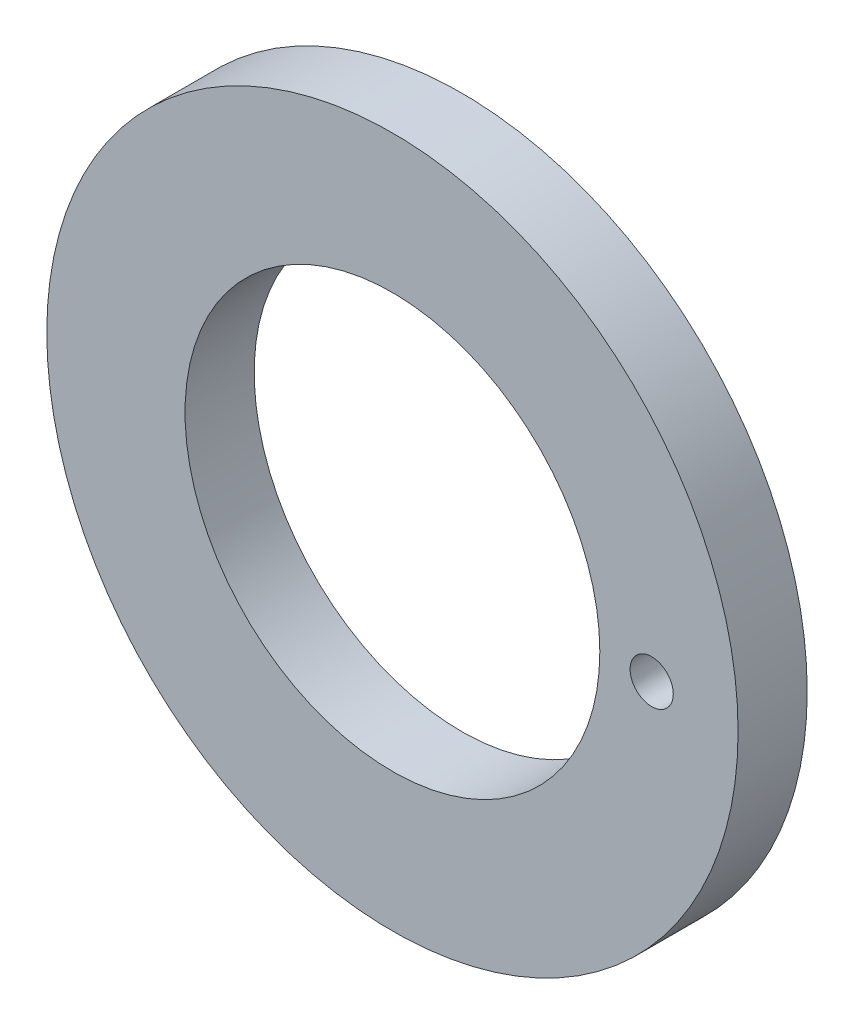
ISO-10303-21;
HEADER;
FILE_DESCRIPTION(('STEP AP214'),'2;1');
FILE_NAME('part.step','',(''),(''),'','','');
FILE_SCHEMA(('AUTOMOTIVE_DESIGN { 1 0 10303 214 1 1 1 1 }'));
ENDSEC;
DATA;
#1=APPLICATION_CONTEXT('core data for automotive mechanical design processes');
#2=APPLICATION_PROTOCOL_DEFINITION('international standard','automotive_design',2000,#1);
#3=PRODUCT_CONTEXT('',#1,'mechanical');
#4=PRODUCT('Part','Part','',(#3));
#5=PRODUCT_RELATED_PRODUCT_CATEGORY('part','',(#4));
#6=PRODUCT_DEFINITION_FORMATION('','',#4);
#7=PRODUCT_DEFINITION_CONTEXT('part definition',#1,'design');
#8=PRODUCT_DEFINITION('design','',#6,#7);
#9=PRODUCT_DEFINITION_SHAPE('','',#8);
#10=(LENGTH_UNIT() NAMED_UNIT(*) SI_UNIT(.MILLI.,.METRE.));
#11=(NAMED_UNIT(*) PLANE_ANGLE_UNIT() SI_UNIT($,.RADIAN.));
#12=(NAMED_UNIT(*) SI_UNIT($,.STERADIAN.) SOLID_ANGLE_UNIT());
#13=UNCERTAINTY_MEASURE_WITH_UNIT(LENGTH_MEASURE(1.E-05),#10,'distance_accuracy_value','');
#14=(GEOMETRIC_REPRESENTATION_CONTEXT(3) GLOBAL_UNCERTAINTY_ASSIGNED_CONTEXT((#13)) GLOBAL_UNIT_ASSIGNED_CONTEXT((#10,
#11,#12)) REPRESENTATION_CONTEXT('',''));
#15=CARTESIAN_POINT('',(0.,0.,0.));
#16=DIRECTION('',(0.,0.,1.));
#17=DIRECTION('',(1.,0.,0.));
#18=AXIS2_PLACEMENT_3D('',#15,#16,#17);
#19=CARTESIAN_POINT('',(0.,0.,5.08));
#20=DIRECTION('',(0.,0.,1.));
#21=DIRECTION('',(1.,0.,0.));
#22=AXIS2_PLACEMENT_3D('',#19,#20,#21);
#23=PLANE('',#22);
#24=CARTESIAN_POINT('',(19.05,0.,5.08));
#25=DIRECTION('',(0.,0.,1.));
#26=DIRECTION('',(1.,0.,0.));
#27=AXIS2_PLACEMENT_3D('',#24,#25,#26);
#28=CIRCLE('',#27,1.5875);
#29=CARTESIAN_POINT('',(20.6375,0.,5.08));
#30=VERTEX_POINT('',#29);
#31=EDGE_CURVE('E65',#30,#30,#28,.T.);
#32=ORIENTED_EDGE('',*,*,#31,.F.);
#33=EDGE_LOOP('',(#32));
#34=FACE_BOUND('',#33,.T.);
#35=CARTESIAN_POINT('',(0.,0.,5.08));
#36=DIRECTION('',(0.,0.,1.));
#37=DIRECTION('',(1.,0.,0.));
#38=AXIS2_PLACEMENT_3D('',#35,#36,#37);
#39=CIRCLE('',#38,25.4);
#40=CARTESIAN_POINT('',(25.4,0.,5.08));
#41=VERTEX_POINT('',#40);
#42=EDGE_CURVE('E10',#41,#41,#39,.T.);
#43=ORIENTED_EDGE('',*,*,#42,.T.);
#44=EDGE_LOOP('',(#43));
#45=FACE_BOUND('',#44,.T.);
#46=CARTESIAN_POINT('',(0.,0.,5.08));
#47=DIRECTION('',(0.,0.,1.));
#48=DIRECTION('',(1.,0.,0.));
#49=AXIS2_PLACEMENT_3D('',#46,#47,#48);
#50=CIRCLE('',#49,15.24);
#51=CARTESIAN_POINT('',(15.24,0.,5.08));
#52=VERTEX_POINT('',#51);
#53=EDGE_CURVE('E55',#52,#52,#50,.T.);
#54=ORIENTED_EDGE('',*,*,#53,.F.);
#55=EDGE_LOOP('',(#54));
#56=FACE_BOUND('',#55,.T.);
#57=ADVANCED_FACE('F42',(#34,#45,#56),#23,.T.);
#58=CARTESIAN_POINT('',(0.,0.,0.));
#59=DIRECTION('',(0.,0.,1.));
#60=DIRECTION('',(1.,0.,0.));
#61=AXIS2_PLACEMENT_3D('',#58,#59,#60);
#62=PLANE('',#61);
#63=CARTESIAN_POINT('',(19.05,0.,0.));
#64=DIRECTION('',(0.,0.,1.));
#65=DIRECTION('',(1.,0.,0.));
#66=AXIS2_PLACEMENT_3D('',#63,#64,#65);
#67=CIRCLE('',#66,1.5875);
#68=CARTESIAN_POINT('',(20.6375,0.,0.));
#69=VERTEX_POINT('',#68);
#70=EDGE_CURVE('E61',#69,#69,#67,.T.);
#71=ORIENTED_EDGE('',*,*,#70,.T.);
#72=EDGE_LOOP('',(#71));
#73=FACE_BOUND('',#72,.T.);
#74=CARTESIAN_POINT('',(0.,0.,0.));
#75=DIRECTION('',(0.,0.,1.));
#76=DIRECTION('',(1.,0.,0.));
#77=AXIS2_PLACEMENT_3D('',#74,#75,#76);
#78=CIRCLE('',#77,25.4);
#79=CARTESIAN_POINT('',(25.4,0.,0.));
#80=VERTEX_POINT('',#79);
#81=EDGE_CURVE('E46',#80,#80,#78,.T.);
#82=ORIENTED_EDGE('',*,*,#81,.F.);
#83=EDGE_LOOP('',(#82));
#84=FACE_BOUND('',#83,.T.);
#85=CARTESIAN_POINT('',(0.,0.,0.));
#86=DIRECTION('',(0.,0.,1.));
#87=DIRECTION('',(1.,0.,0.));
#88=AXIS2_PLACEMENT_3D('',#85,#86,#87);
#89=CIRCLE('',#88,15.24);
#90=CARTESIAN_POINT('',(15.24,0.,0.));
#91=VERTEX_POINT('',#90);
#92=EDGE_CURVE('E57',#91,#91,#89,.T.);
#93=ORIENTED_EDGE('',*,*,#92,.T.);
#94=EDGE_LOOP('',(#93));
#95=FACE_BOUND('',#94,.T.);
#96=ADVANCED_FACE('F73',(#73,#84,#95),#62,.F.);
#97=CARTESIAN_POINT('',(0.,0.,5.08));
#98=DIRECTION('',(0.,0.,-1.));
#99=DIRECTION('',(-1.,0.,0.));
#100=AXIS2_PLACEMENT_3D('',#97,#98,#99);
#101=CYLINDRICAL_SURFACE('',#100,25.4);
#102=ORIENTED_EDGE('',*,*,#42,.F.);
#103=EDGE_LOOP('',(#102));
#104=FACE_BOUND('',#103,.T.);
#105=ORIENTED_EDGE('',*,*,#81,.T.);
#106=EDGE_LOOP('',(#105));
#107=FACE_BOUND('',#106,.T.);
#108=ADVANCED_FACE('F44',(#104,#107),#101,.T.);
#109=CARTESIAN_POINT('',(0.,0.,5.08));
#110=DIRECTION('',(0.,0.,-1.));
#111=DIRECTION('',(-1.,0.,0.));
#112=AXIS2_PLACEMENT_3D('',#109,#110,#111);
#113=CYLINDRICAL_SURFACE('',#112,15.24);
#114=ORIENTED_EDGE('',*,*,#53,.T.);
#115=EDGE_LOOP('',(#114));
#116=FACE_BOUND('',#115,.T.);
#117=ORIENTED_EDGE('',*,*,#92,.F.);
#118=EDGE_LOOP('',(#117));
#119=FACE_BOUND('',#118,.T.);
#120=ADVANCED_FACE('F79',(#116,#119),#113,.F.);
#121=CARTESIAN_POINT('',(19.05,0.,0.));
#122=DIRECTION('',(0.,0.,1.));
#123=DIRECTION('',(1.,0.,0.));
#124=AXIS2_PLACEMENT_3D('',#121,#122,#123);
#125=CYLINDRICAL_SURFACE('',#124,1.5875);
#126=ORIENTED_EDGE('',*,*,#70,.F.);
#127=EDGE_LOOP('',(#126));
#128=FACE_BOUND('',#127,.T.);
#129=ORIENTED_EDGE('',*,*,#31,.T.);
#130=EDGE_LOOP('',(#129));
#131=FACE_BOUND('',#130,.T.);
#132=ADVANCED_FACE('F76',(#128,#131),#125,.F.);
#133=CLOSED_SHELL('',(#57,#96,#108,#120,#132));
#134=MANIFOLD_SOLID_BREP('B2',#133);
#135=ADVANCED_BREP_SHAPE_REPRESENTATION('',(#18,#134),#14);
#136=SHAPE_DEFINITION_REPRESENTATION(#9,#135);
ENDSEC;
END-ISO-10303-21;
